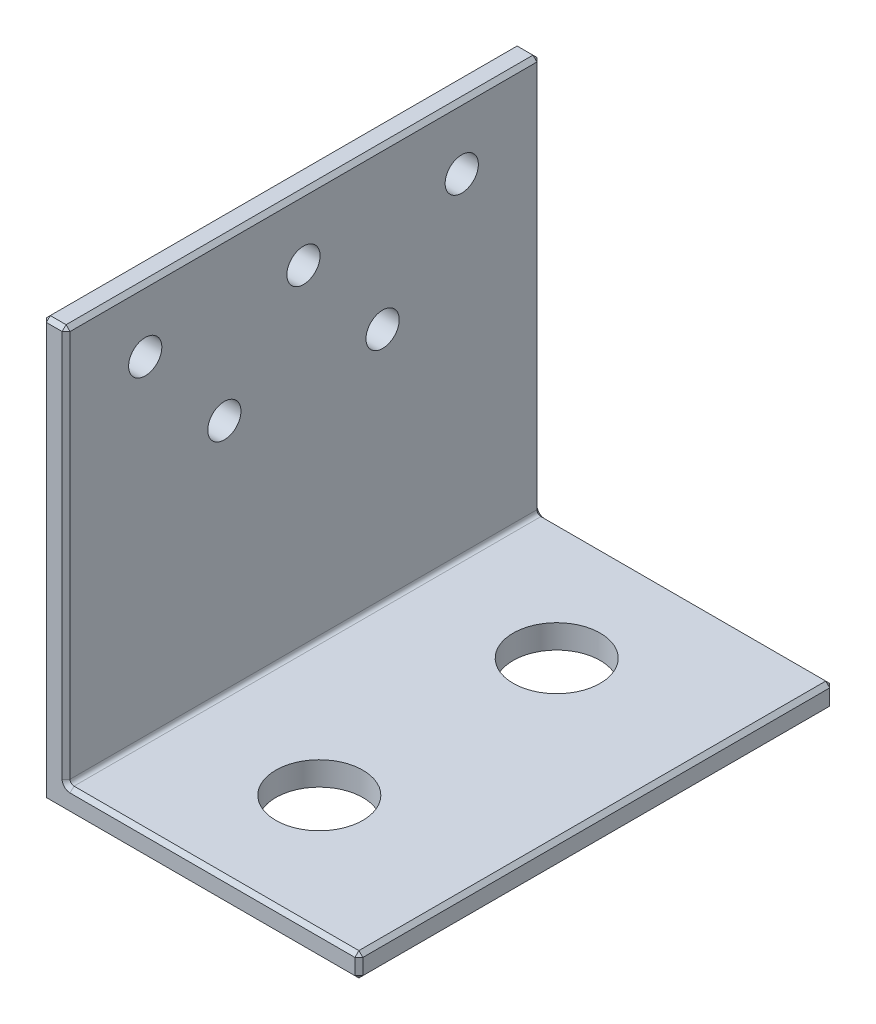
ISO-10303-21;
HEADER;
FILE_DESCRIPTION(('STEP AP214'),'2;1');
FILE_NAME('part.step','',(''),(''),'','','');
FILE_SCHEMA(('AUTOMOTIVE_DESIGN { 1 0 10303 214 1 1 1 1 }'));
ENDSEC;
DATA;
#1=APPLICATION_CONTEXT('core data for automotive mechanical design processes');
#2=APPLICATION_PROTOCOL_DEFINITION('international standard','automotive_design',2000,#1);
#3=PRODUCT_CONTEXT('',#1,'mechanical');
#4=PRODUCT('Part','Part','',(#3));
#5=PRODUCT_RELATED_PRODUCT_CATEGORY('part','',(#4));
#6=PRODUCT_DEFINITION_FORMATION('','',#4);
#7=PRODUCT_DEFINITION_CONTEXT('part definition',#1,'design');
#8=PRODUCT_DEFINITION('design','',#6,#7);
#9=PRODUCT_DEFINITION_SHAPE('','',#8);
#10=(LENGTH_UNIT() NAMED_UNIT(*) SI_UNIT(.MILLI.,.METRE.));
#11=(NAMED_UNIT(*) PLANE_ANGLE_UNIT() SI_UNIT($,.RADIAN.));
#12=(NAMED_UNIT(*) SI_UNIT($,.STERADIAN.) SOLID_ANGLE_UNIT());
#13=UNCERTAINTY_MEASURE_WITH_UNIT(LENGTH_MEASURE(1.E-05),#10,'distance_accuracy_value','');
#14=(GEOMETRIC_REPRESENTATION_CONTEXT(3) GLOBAL_UNCERTAINTY_ASSIGNED_CONTEXT((#13)) GLOBAL_UNIT_ASSIGNED_CONTEXT((#10,
#11,#12)) REPRESENTATION_CONTEXT('',''));
#15=CARTESIAN_POINT('',(0.,0.,0.));
#16=DIRECTION('',(0.,0.,1.));
#17=DIRECTION('',(1.,0.,0.));
#18=AXIS2_PLACEMENT_3D('',#15,#16,#17);
#19=CARTESIAN_POINT('',(0.,0.,60.));
#20=DIRECTION('',(0.,1.,0.));
#21=DIRECTION('',(0.,0.,1.));
#22=AXIS2_PLACEMENT_3D('',#19,#20,#21);
#23=PLANE('',#22);
#24=DIRECTION('',(-1.,0.,0.));
#25=VECTOR('',#24,1.);
#26=CARTESIAN_POINT('',(0.,0.,59.5));
#27=LINE('',#26,#25);
#28=CARTESIAN_POINT('',(39.5,0.,59.5));
#29=VERTEX_POINT('',#28);
#30=CARTESIAN_POINT('',(0.5,0.,59.5));
#31=VERTEX_POINT('',#30);
#32=EDGE_CURVE('E340',#29,#31,#27,.T.);
#33=ORIENTED_EDGE('',*,*,#32,.T.);
#34=DIRECTION('',(0.,0.,-1.));
#35=VECTOR('',#34,1.);
#36=CARTESIAN_POINT('',(0.5,0.,60.));
#37=LINE('',#36,#35);
#38=CARTESIAN_POINT('',(0.5,0.,0.5));
#39=VERTEX_POINT('',#38);
#40=EDGE_CURVE('E346',#31,#39,#37,.T.);
#41=ORIENTED_EDGE('',*,*,#40,.T.);
#42=DIRECTION('',(1.,0.,0.));
#43=VECTOR('',#42,1.);
#44=CARTESIAN_POINT('',(40.,0.,0.5));
#45=LINE('',#44,#43);
#46=CARTESIAN_POINT('',(39.5,0.,0.5));
#47=VERTEX_POINT('',#46);
#48=EDGE_CURVE('E344',#39,#47,#45,.T.);
#49=ORIENTED_EDGE('',*,*,#48,.T.);
#50=DIRECTION('',(0.,0.,1.));
#51=VECTOR('',#50,1.);
#52=CARTESIAN_POINT('',(39.5,0.,60.));
#53=LINE('',#52,#51);
#54=EDGE_CURVE('E342',#47,#29,#53,.T.);
#55=ORIENTED_EDGE('',*,*,#54,.T.);
#56=EDGE_LOOP('',(#33,#41,#49,#55));
#57=FACE_BOUND('',#56,.T.);
#58=CARTESIAN_POINT('',(20.,0.,45.));
#59=DIRECTION('',(0.,1.,0.));
#60=DIRECTION('',(0.,0.,1.));
#61=AXIS2_PLACEMENT_3D('',#58,#59,#60);
#62=CIRCLE('',#61,5.5);
#63=CARTESIAN_POINT('',(20.,0.,50.5));
#64=VERTEX_POINT('',#63);
#65=EDGE_CURVE('E280',#64,#64,#62,.T.);
#66=ORIENTED_EDGE('',*,*,#65,.T.);
#67=EDGE_LOOP('',(#66));
#68=FACE_BOUND('',#67,.T.);
#69=CARTESIAN_POINT('',(20.,0.,15.));
#70=DIRECTION('',(0.,1.,0.));
#71=DIRECTION('',(0.,0.,1.));
#72=AXIS2_PLACEMENT_3D('',#69,#70,#71);
#73=CIRCLE('',#72,5.5);
#74=CARTESIAN_POINT('',(20.,0.,20.5));
#75=VERTEX_POINT('',#74);
#76=EDGE_CURVE('E286',#75,#75,#73,.T.);
#77=ORIENTED_EDGE('',*,*,#76,.T.);
#78=EDGE_LOOP('',(#77));
#79=FACE_BOUND('',#78,.T.);
#80=ADVANCED_FACE('F38',(#57,#68,#79),#23,.F.);
#81=CARTESIAN_POINT('',(40.,0.,60.));
#82=DIRECTION('',(-1.,0.,0.));
#83=DIRECTION('',(0.,0.,1.));
#84=AXIS2_PLACEMENT_3D('',#81,#82,#83);
#85=PLANE('',#84);
#86=DIRECTION('',(0.,-1.,0.));
#87=VECTOR('',#86,1.);
#88=CARTESIAN_POINT('',(40.,0.,59.5));
#89=LINE('',#88,#87);
#90=CARTESIAN_POINT('',(40.,2.5,59.5));
#91=VERTEX_POINT('',#90);
#92=CARTESIAN_POINT('',(40.,0.5,59.5));
#93=VERTEX_POINT('',#92);
#94=EDGE_CURVE('E202',#91,#93,#89,.T.);
#95=ORIENTED_EDGE('',*,*,#94,.T.);
#96=DIRECTION('',(0.,0.,-1.));
#97=VECTOR('',#96,1.);
#98=CARTESIAN_POINT('',(40.,0.5,60.));
#99=LINE('',#98,#97);
#100=CARTESIAN_POINT('',(40.,0.5,0.5));
#101=VERTEX_POINT('',#100);
#102=EDGE_CURVE('E354',#93,#101,#99,.T.);
#103=ORIENTED_EDGE('',*,*,#102,.T.);
#104=DIRECTION('',(0.,1.,0.));
#105=VECTOR('',#104,1.);
#106=CARTESIAN_POINT('',(40.,3.,0.5));
#107=LINE('',#106,#105);
#108=CARTESIAN_POINT('',(40.,2.5,0.5));
#109=VERTEX_POINT('',#108);
#110=EDGE_CURVE('E351',#101,#109,#107,.T.);
#111=ORIENTED_EDGE('',*,*,#110,.T.);
#112=DIRECTION('',(0.,0.,1.));
#113=VECTOR('',#112,1.);
#114=CARTESIAN_POINT('',(40.,2.5,60.));
#115=LINE('',#114,#113);
#116=EDGE_CURVE('E349',#109,#91,#115,.T.);
#117=ORIENTED_EDGE('',*,*,#116,.T.);
#118=EDGE_LOOP('',(#95,#103,#111,#117));
#119=FACE_BOUND('',#118,.T.);
#120=ADVANCED_FACE('F476',(#119),#85,.F.);
#121=CARTESIAN_POINT('',(3.,3.,60.));
#122=DIRECTION('',(0.,-1.,0.));
#123=DIRECTION('',(1.,0.,0.));
#124=AXIS2_PLACEMENT_3D('',#121,#122,#123);
#125=PLANE('',#124);
#126=CARTESIAN_POINT('',(20.,3.,45.));
#127=DIRECTION('',(0.,1.,0.));
#128=DIRECTION('',(0.,0.,1.));
#129=AXIS2_PLACEMENT_3D('',#126,#127,#128);
#130=CIRCLE('',#129,5.5);
#131=CARTESIAN_POINT('',(20.,3.,50.5));
#132=VERTEX_POINT('',#131);
#133=EDGE_CURVE('E277',#132,#132,#130,.T.);
#134=ORIENTED_EDGE('',*,*,#133,.F.);
#135=EDGE_LOOP('',(#134));
#136=FACE_BOUND('',#135,.T.);
#137=CARTESIAN_POINT('',(20.,3.,15.));
#138=DIRECTION('',(0.,1.,0.));
#139=DIRECTION('',(0.,0.,1.));
#140=AXIS2_PLACEMENT_3D('',#137,#138,#139);
#141=CIRCLE('',#140,5.5);
#142=CARTESIAN_POINT('',(20.,3.,20.5));
#143=VERTEX_POINT('',#142);
#144=EDGE_CURVE('E283',#143,#143,#141,.T.);
#145=ORIENTED_EDGE('',*,*,#144,.F.);
#146=EDGE_LOOP('',(#145));
#147=FACE_BOUND('',#146,.T.);
#148=DIRECTION('',(0.,0.,-1.));
#149=VECTOR('',#148,1.);
#150=CARTESIAN_POINT('',(39.5,3.,60.));
#151=LINE('',#150,#149);
#152=CARTESIAN_POINT('',(39.5,3.,59.5));
#153=VERTEX_POINT('',#152);
#154=CARTESIAN_POINT('',(39.5,3.,0.5));
#155=VERTEX_POINT('',#154);
#156=EDGE_CURVE('E47',#153,#155,#151,.T.);
#157=ORIENTED_EDGE('',*,*,#156,.T.);
#158=DIRECTION('',(-1.,0.,0.));
#159=VECTOR('',#158,1.);
#160=CARTESIAN_POINT('',(3.5,3.,0.5));
#161=LINE('',#160,#159);
#162=CARTESIAN_POINT('',(3.5,3.,0.5));
#163=VERTEX_POINT('',#162);
#164=EDGE_CURVE('E11',#155,#163,#161,.T.);
#165=ORIENTED_EDGE('',*,*,#164,.T.);
#166=DIRECTION('',(0.,0.,-1.));
#167=VECTOR('',#166,1.);
#168=CARTESIAN_POINT('',(3.5,3.,60.));
#169=LINE('',#168,#167);
#170=CARTESIAN_POINT('',(3.5,3.,59.5));
#171=VERTEX_POINT('',#170);
#172=EDGE_CURVE('E191',#163,#171,#169,.F.);
#173=ORIENTED_EDGE('',*,*,#172,.T.);
#174=DIRECTION('',(1.,0.,0.));
#175=VECTOR('',#174,1.);
#176=CARTESIAN_POINT('',(3.,3.,59.5));
#177=LINE('',#176,#175);
#178=EDGE_CURVE('E58',#171,#153,#177,.T.);
#179=ORIENTED_EDGE('',*,*,#178,.T.);
#180=EDGE_LOOP('',(#157,#165,#173,#179));
#181=FACE_BOUND('',#180,.T.);
#182=ADVANCED_FACE('F481',(#136,#147,#181),#125,.F.);
#183=CARTESIAN_POINT('',(3.,53.,60.));
#184=DIRECTION('',(-1.,0.,0.));
#185=DIRECTION('',(0.,-1.,0.));
#186=AXIS2_PLACEMENT_3D('',#183,#184,#185);
#187=PLANE('',#186);
#188=CARTESIAN_POINT('',(3.,45.,50.));
#189=DIRECTION('',(1.,0.,0.));
#190=DIRECTION('',(0.,0.,-1.));
#191=AXIS2_PLACEMENT_3D('',#188,#189,#190);
#192=CIRCLE('',#191,2.1);
#193=CARTESIAN_POINT('',(3.,45.,47.9));
#194=VERTEX_POINT('',#193);
#195=EDGE_CURVE('E240',#194,#194,#192,.T.);
#196=ORIENTED_EDGE('',*,*,#195,.F.);
#197=EDGE_LOOP('',(#196));
#198=FACE_BOUND('',#197,.T.);
#199=CARTESIAN_POINT('',(3.,33.,40.));
#200=DIRECTION('',(1.,0.,0.));
#201=DIRECTION('',(0.,0.,-1.));
#202=AXIS2_PLACEMENT_3D('',#199,#200,#201);
#203=CIRCLE('',#202,2.1);
#204=CARTESIAN_POINT('',(3.,33.,37.9));
#205=VERTEX_POINT('',#204);
#206=EDGE_CURVE('E251',#205,#205,#203,.T.);
#207=ORIENTED_EDGE('',*,*,#206,.F.);
#208=EDGE_LOOP('',(#207));
#209=FACE_BOUND('',#208,.T.);
#210=CARTESIAN_POINT('',(3.,45.,30.));
#211=DIRECTION('',(1.,0.,0.));
#212=DIRECTION('',(0.,0.,-1.));
#213=AXIS2_PLACEMENT_3D('',#210,#211,#212);
#214=CIRCLE('',#213,2.1);
#215=CARTESIAN_POINT('',(3.,45.,27.9));
#216=VERTEX_POINT('',#215);
#217=EDGE_CURVE('E259',#216,#216,#214,.T.);
#218=ORIENTED_EDGE('',*,*,#217,.F.);
#219=EDGE_LOOP('',(#218));
#220=FACE_BOUND('',#219,.T.);
#221=CARTESIAN_POINT('',(3.,33.,20.));
#222=DIRECTION('',(1.,0.,0.));
#223=DIRECTION('',(0.,0.,-1.));
#224=AXIS2_PLACEMENT_3D('',#221,#222,#223);
#225=CIRCLE('',#224,2.1);
#226=CARTESIAN_POINT('',(3.,33.,17.9));
#227=VERTEX_POINT('',#226);
#228=EDGE_CURVE('E265',#227,#227,#225,.T.);
#229=ORIENTED_EDGE('',*,*,#228,.F.);
#230=EDGE_LOOP('',(#229));
#231=FACE_BOUND('',#230,.T.);
#232=CARTESIAN_POINT('',(3.,45.,10.));
#233=DIRECTION('',(1.,0.,0.));
#234=DIRECTION('',(0.,0.,-1.));
#235=AXIS2_PLACEMENT_3D('',#232,#233,#234);
#236=CIRCLE('',#235,2.1);
#237=CARTESIAN_POINT('',(3.,45.,7.9));
#238=VERTEX_POINT('',#237);
#239=EDGE_CURVE('E271',#238,#238,#236,.T.);
#240=ORIENTED_EDGE('',*,*,#239,.F.);
#241=EDGE_LOOP('',(#240));
#242=FACE_BOUND('',#241,.T.);
#243=DIRECTION('',(0.,0.,-1.));
#244=VECTOR('',#243,1.);
#245=CARTESIAN_POINT('',(3.,3.5,0.));
#246=LINE('',#245,#244);
#247=CARTESIAN_POINT('',(3.,3.5,59.5));
#248=VERTEX_POINT('',#247);
#249=CARTESIAN_POINT('',(3.,3.5,0.5));
#250=VERTEX_POINT('',#249);
#251=EDGE_CURVE('E288',#248,#250,#246,.T.);
#252=ORIENTED_EDGE('',*,*,#251,.T.);
#253=DIRECTION('',(0.,1.,0.));
#254=VECTOR('',#253,1.);
#255=CARTESIAN_POINT('',(3.,53.,0.5));
#256=LINE('',#255,#254);
#257=CARTESIAN_POINT('',(3.,52.5,0.5));
#258=VERTEX_POINT('',#257);
#259=EDGE_CURVE('E323',#250,#258,#256,.T.);
#260=ORIENTED_EDGE('',*,*,#259,.T.);
#261=DIRECTION('',(0.,0.,1.));
#262=VECTOR('',#261,1.);
#263=CARTESIAN_POINT('',(3.,52.5,60.));
#264=LINE('',#263,#262);
#265=CARTESIAN_POINT('',(3.,52.5,59.5));
#266=VERTEX_POINT('',#265);
#267=EDGE_CURVE('E320',#258,#266,#264,.T.);
#268=ORIENTED_EDGE('',*,*,#267,.T.);
#269=DIRECTION('',(0.,-1.,0.));
#270=VECTOR('',#269,1.);
#271=CARTESIAN_POINT('',(3.,53.,59.5));
#272=LINE('',#271,#270);
#273=EDGE_CURVE('E318',#266,#248,#272,.T.);
#274=ORIENTED_EDGE('',*,*,#273,.T.);
#275=EDGE_LOOP('',(#252,#260,#268,#274));
#276=FACE_BOUND('',#275,.T.);
#277=ADVANCED_FACE('F526',(#198,#209,#220,#231,#242,#276),#187,.F.);
#278=CARTESIAN_POINT('',(0.,53.,60.));
#279=DIRECTION('',(0.,-1.,0.));
#280=DIRECTION('',(0.,0.,-1.));
#281=AXIS2_PLACEMENT_3D('',#278,#279,#280);
#282=PLANE('',#281);
#283=DIRECTION('',(1.,0.,0.));
#284=VECTOR('',#283,1.);
#285=CARTESIAN_POINT('',(0.,53.,59.5));
#286=LINE('',#285,#284);
#287=CARTESIAN_POINT('',(0.5,53.,59.5));
#288=VERTEX_POINT('',#287);
#289=CARTESIAN_POINT('',(2.5,53.,59.5));
#290=VERTEX_POINT('',#289);
#291=EDGE_CURVE('E313',#288,#290,#286,.T.);
#292=ORIENTED_EDGE('',*,*,#291,.T.);
#293=DIRECTION('',(0.,0.,-1.));
#294=VECTOR('',#293,1.);
#295=CARTESIAN_POINT('',(2.5,53.,60.));
#296=LINE('',#295,#294);
#297=CARTESIAN_POINT('',(2.5,53.,0.5));
#298=VERTEX_POINT('',#297);
#299=EDGE_CURVE('E315',#290,#298,#296,.T.);
#300=ORIENTED_EDGE('',*,*,#299,.T.);
#301=DIRECTION('',(-1.,0.,0.));
#302=VECTOR('',#301,1.);
#303=CARTESIAN_POINT('',(0.,53.,0.5));
#304=LINE('',#303,#302);
#305=CARTESIAN_POINT('',(0.5,53.,0.5));
#306=VERTEX_POINT('',#305);
#307=EDGE_CURVE('E309',#298,#306,#304,.T.);
#308=ORIENTED_EDGE('',*,*,#307,.T.);
#309=DIRECTION('',(0.,0.,1.));
#310=VECTOR('',#309,1.);
#311=CARTESIAN_POINT('',(0.5,53.,60.));
#312=LINE('',#311,#310);
#313=EDGE_CURVE('E311',#306,#288,#312,.T.);
#314=ORIENTED_EDGE('',*,*,#313,.T.);
#315=EDGE_LOOP('',(#292,#300,#308,#314));
#316=FACE_BOUND('',#315,.T.);
#317=ADVANCED_FACE('F538',(#316),#282,.F.);
#318=CARTESIAN_POINT('',(0.,3.,60.));
#319=DIRECTION('',(1.,0.,0.));
#320=DIRECTION('',(0.,0.,-1.));
#321=AXIS2_PLACEMENT_3D('',#318,#319,#320);
#322=PLANE('',#321);
#323=DIRECTION('',(0.,0.,1.));
#324=VECTOR('',#323,1.);
#325=CARTESIAN_POINT('',(0.,0.5,60.));
#326=LINE('',#325,#324);
#327=CARTESIAN_POINT('',(0.,0.5,0.5));
#328=VERTEX_POINT('',#327);
#329=CARTESIAN_POINT('',(0.,0.5,59.5));
#330=VERTEX_POINT('',#329);
#331=EDGE_CURVE('E302',#328,#330,#326,.T.);
#332=ORIENTED_EDGE('',*,*,#331,.T.);
#333=DIRECTION('',(0.,1.,0.));
#334=VECTOR('',#333,1.);
#335=CARTESIAN_POINT('',(0.,3.,59.5));
#336=LINE('',#335,#334);
#337=CARTESIAN_POINT('',(0.,52.5,59.5));
#338=VERTEX_POINT('',#337);
#339=EDGE_CURVE('E306',#330,#338,#336,.T.);
#340=ORIENTED_EDGE('',*,*,#339,.T.);
#341=DIRECTION('',(0.,0.,-1.));
#342=VECTOR('',#341,1.);
#343=CARTESIAN_POINT('',(0.,52.5,60.));
#344=LINE('',#343,#342);
#345=CARTESIAN_POINT('',(0.,52.5,0.5));
#346=VERTEX_POINT('',#345);
#347=EDGE_CURVE('E304',#338,#346,#344,.T.);
#348=ORIENTED_EDGE('',*,*,#347,.T.);
#349=DIRECTION('',(0.,-1.,0.));
#350=VECTOR('',#349,1.);
#351=CARTESIAN_POINT('',(0.,0.,0.5));
#352=LINE('',#351,#350);
#353=EDGE_CURVE('E300',#346,#328,#352,.T.);
#354=ORIENTED_EDGE('',*,*,#353,.T.);
#355=EDGE_LOOP('',(#332,#340,#348,#354));
#356=FACE_BOUND('',#355,.T.);
#357=CARTESIAN_POINT('',(0.,45.,50.));
#358=DIRECTION('',(1.,0.,0.));
#359=DIRECTION('',(0.,0.,-1.));
#360=AXIS2_PLACEMENT_3D('',#357,#358,#359);
#361=CIRCLE('',#360,2.1);
#362=CARTESIAN_POINT('',(0.,45.,47.9));
#363=VERTEX_POINT('',#362);
#364=EDGE_CURVE('E246',#363,#363,#361,.T.);
#365=ORIENTED_EDGE('',*,*,#364,.T.);
#366=EDGE_LOOP('',(#365));
#367=FACE_BOUND('',#366,.T.);
#368=CARTESIAN_POINT('',(0.,33.,40.));
#369=DIRECTION('',(1.,0.,0.));
#370=DIRECTION('',(0.,0.,-1.));
#371=AXIS2_PLACEMENT_3D('',#368,#369,#370);
#372=CIRCLE('',#371,2.1);
#373=CARTESIAN_POINT('',(0.,33.,37.9));
#374=VERTEX_POINT('',#373);
#375=EDGE_CURVE('E256',#374,#374,#372,.T.);
#376=ORIENTED_EDGE('',*,*,#375,.T.);
#377=EDGE_LOOP('',(#376));
#378=FACE_BOUND('',#377,.T.);
#379=CARTESIAN_POINT('',(0.,45.,30.));
#380=DIRECTION('',(1.,0.,0.));
#381=DIRECTION('',(0.,0.,-1.));
#382=AXIS2_PLACEMENT_3D('',#379,#380,#381);
#383=CIRCLE('',#382,2.1);
#384=CARTESIAN_POINT('',(0.,45.,27.9));
#385=VERTEX_POINT('',#384);
#386=EDGE_CURVE('E262',#385,#385,#383,.T.);
#387=ORIENTED_EDGE('',*,*,#386,.T.);
#388=EDGE_LOOP('',(#387));
#389=FACE_BOUND('',#388,.T.);
#390=CARTESIAN_POINT('',(0.,33.,20.));
#391=DIRECTION('',(1.,0.,0.));
#392=DIRECTION('',(0.,0.,-1.));
#393=AXIS2_PLACEMENT_3D('',#390,#391,#392);
#394=CIRCLE('',#393,2.1);
#395=CARTESIAN_POINT('',(0.,33.,17.9));
#396=VERTEX_POINT('',#395);
#397=EDGE_CURVE('E268',#396,#396,#394,.T.);
#398=ORIENTED_EDGE('',*,*,#397,.T.);
#399=EDGE_LOOP('',(#398));
#400=FACE_BOUND('',#399,.T.);
#401=CARTESIAN_POINT('',(0.,45.,10.));
#402=DIRECTION('',(1.,0.,0.));
#403=DIRECTION('',(0.,0.,-1.));
#404=AXIS2_PLACEMENT_3D('',#401,#402,#403);
#405=CIRCLE('',#404,2.1);
#406=CARTESIAN_POINT('',(0.,45.,7.9));
#407=VERTEX_POINT('',#406);
#408=EDGE_CURVE('E274',#407,#407,#405,.T.);
#409=ORIENTED_EDGE('',*,*,#408,.T.);
#410=EDGE_LOOP('',(#409));
#411=FACE_BOUND('',#410,.T.);
#412=ADVANCED_FACE('F450',(#356,#367,#378,#389,#400,#411),#322,.F.);
#413=CARTESIAN_POINT('',(0.,0.,60.));
#414=DIRECTION('',(0.,0.,-1.));
#415=DIRECTION('',(-1.,0.,0.));
#416=AXIS2_PLACEMENT_3D('',#413,#414,#415);
#417=PLANE('',#416);
#418=DIRECTION('',(-1.,0.,0.));
#419=VECTOR('',#418,1.);
#420=CARTESIAN_POINT('',(0.,52.5,60.));
#421=LINE('',#420,#419);
#422=CARTESIAN_POINT('',(2.5,52.5,60.));
#423=VERTEX_POINT('',#422);
#424=CARTESIAN_POINT('',(0.5,52.5,60.));
#425=VERTEX_POINT('',#424);
#426=EDGE_CURVE('E296',#423,#425,#421,.T.);
#427=ORIENTED_EDGE('',*,*,#426,.T.);
#428=DIRECTION('',(0.,-1.,0.));
#429=VECTOR('',#428,1.);
#430=CARTESIAN_POINT('',(0.5,0.,60.));
#431=LINE('',#430,#429);
#432=CARTESIAN_POINT('',(0.5,0.5,60.));
#433=VERTEX_POINT('',#432);
#434=EDGE_CURVE('E298',#425,#433,#431,.T.);
#435=ORIENTED_EDGE('',*,*,#434,.T.);
#436=DIRECTION('',(1.,0.,0.));
#437=VECTOR('',#436,1.);
#438=CARTESIAN_POINT('',(0.,0.5,60.));
#439=LINE('',#438,#437);
#440=CARTESIAN_POINT('',(39.5,0.5,60.));
#441=VERTEX_POINT('',#440);
#442=EDGE_CURVE('E174',#433,#441,#439,.T.);
#443=ORIENTED_EDGE('',*,*,#442,.T.);
#444=DIRECTION('',(0.,1.,0.));
#445=VECTOR('',#444,1.);
#446=CARTESIAN_POINT('',(39.5,0.,60.));
#447=LINE('',#446,#445);
#448=CARTESIAN_POINT('',(39.5,2.5,60.));
#449=VERTEX_POINT('',#448);
#450=EDGE_CURVE('E167',#441,#449,#447,.T.);
#451=ORIENTED_EDGE('',*,*,#450,.T.);
#452=DIRECTION('',(-1.,0.,0.));
#453=VECTOR('',#452,1.);
#454=CARTESIAN_POINT('',(0.,2.5,60.));
#455=LINE('',#454,#453);
#456=CARTESIAN_POINT('',(3.5,2.5,60.));
#457=VERTEX_POINT('',#456);
#458=EDGE_CURVE('E170',#449,#457,#455,.T.);
#459=ORIENTED_EDGE('',*,*,#458,.T.);
#460=CARTESIAN_POINT('',(3.5,3.5,60.));
#461=DIRECTION('',(0.,0.,-1.));
#462=DIRECTION('',(-1.,0.,0.));
#463=AXIS2_PLACEMENT_3D('',#460,#461,#462);
#464=CIRCLE('',#463,1.);
#465=CARTESIAN_POINT('',(2.5,3.5,60.));
#466=VERTEX_POINT('',#465);
#467=EDGE_CURVE('E190',#457,#466,#464,.T.);
#468=ORIENTED_EDGE('',*,*,#467,.T.);
#469=DIRECTION('',(0.,1.,0.));
#470=VECTOR('',#469,1.);
#471=CARTESIAN_POINT('',(2.5,0.,60.));
#472=LINE('',#471,#470);
#473=EDGE_CURVE('E179',#466,#423,#472,.T.);
#474=ORIENTED_EDGE('',*,*,#473,.T.);
#475=EDGE_LOOP('',(#427,#435,#443,#451,#459,#468,#474));
#476=FACE_BOUND('',#475,.T.);
#477=ADVANCED_FACE('F169',(#476),#417,.F.);
#478=CARTESIAN_POINT('',(0.,0.,0.));
#479=DIRECTION('',(0.,0.,-1.));
#480=DIRECTION('',(-1.,0.,0.));
#481=AXIS2_PLACEMENT_3D('',#478,#479,#480);
#482=PLANE('',#481);
#483=DIRECTION('',(0.,1.,0.));
#484=VECTOR('',#483,1.);
#485=CARTESIAN_POINT('',(0.5,53.,0.));
#486=LINE('',#485,#484);
#487=CARTESIAN_POINT('',(0.5,0.5,0.));
#488=VERTEX_POINT('',#487);
#489=CARTESIAN_POINT('',(0.5,52.5,0.));
#490=VERTEX_POINT('',#489);
#491=EDGE_CURVE('E335',#488,#490,#486,.T.);
#492=ORIENTED_EDGE('',*,*,#491,.T.);
#493=DIRECTION('',(1.,0.,0.));
#494=VECTOR('',#493,1.);
#495=CARTESIAN_POINT('',(3.,52.5,0.));
#496=LINE('',#495,#494);
#497=CARTESIAN_POINT('',(2.5,52.5,0.));
#498=VERTEX_POINT('',#497);
#499=EDGE_CURVE('E337',#490,#498,#496,.T.);
#500=ORIENTED_EDGE('',*,*,#499,.T.);
#501=DIRECTION('',(0.,-1.,0.));
#502=VECTOR('',#501,1.);
#503=CARTESIAN_POINT('',(2.5,3.5,0.));
#504=LINE('',#503,#502);
#505=CARTESIAN_POINT('',(2.5,3.5,0.));
#506=VERTEX_POINT('',#505);
#507=EDGE_CURVE('E329',#498,#506,#504,.T.);
#508=ORIENTED_EDGE('',*,*,#507,.T.);
#509=CARTESIAN_POINT('',(3.5,3.5,0.));
#510=DIRECTION('',(0.,0.,-1.));
#511=DIRECTION('',(-1.,0.,0.));
#512=AXIS2_PLACEMENT_3D('',#509,#510,#511);
#513=CIRCLE('',#512,1.);
#514=CARTESIAN_POINT('',(3.5,2.5,0.));
#515=VERTEX_POINT('',#514);
#516=EDGE_CURVE('E327',#506,#515,#513,.F.);
#517=ORIENTED_EDGE('',*,*,#516,.T.);
#518=DIRECTION('',(1.,0.,0.));
#519=VECTOR('',#518,1.);
#520=CARTESIAN_POINT('',(40.,2.5,0.));
#521=LINE('',#520,#519);
#522=CARTESIAN_POINT('',(39.5,2.5,0.));
#523=VERTEX_POINT('',#522);
#524=EDGE_CURVE('E325',#515,#523,#521,.T.);
#525=ORIENTED_EDGE('',*,*,#524,.T.);
#526=DIRECTION('',(0.,-1.,0.));
#527=VECTOR('',#526,1.);
#528=CARTESIAN_POINT('',(39.5,0.,0.));
#529=LINE('',#528,#527);
#530=CARTESIAN_POINT('',(39.5,0.5,0.));
#531=VERTEX_POINT('',#530);
#532=EDGE_CURVE('E331',#523,#531,#529,.T.);
#533=ORIENTED_EDGE('',*,*,#532,.T.);
#534=DIRECTION('',(-1.,0.,0.));
#535=VECTOR('',#534,1.);
#536=CARTESIAN_POINT('',(0.,0.5,0.));
#537=LINE('',#536,#535);
#538=EDGE_CURVE('E333',#531,#488,#537,.T.);
#539=ORIENTED_EDGE('',*,*,#538,.T.);
#540=EDGE_LOOP('',(#492,#500,#508,#517,#525,#533,#539));
#541=FACE_BOUND('',#540,.T.);
#542=ADVANCED_FACE('F548',(#541),#482,.T.);
#543=CARTESIAN_POINT('',(20.,3.,15.));
#544=DIRECTION('',(0.,1.,0.));
#545=DIRECTION('',(0.,0.,1.));
#546=AXIS2_PLACEMENT_3D('',#543,#544,#545);
#547=CYLINDRICAL_SURFACE('',#546,5.5);
#548=ORIENTED_EDGE('',*,*,#144,.T.);
#549=EDGE_LOOP('',(#548));
#550=FACE_BOUND('',#549,.T.);
#551=ORIENTED_EDGE('',*,*,#76,.F.);
#552=EDGE_LOOP('',(#551));
#553=FACE_BOUND('',#552,.T.);
#554=ADVANCED_FACE('F813',(#550,#553),#547,.F.);
#555=CARTESIAN_POINT('',(20.,3.,45.));
#556=DIRECTION('',(0.,1.,0.));
#557=DIRECTION('',(0.,0.,1.));
#558=AXIS2_PLACEMENT_3D('',#555,#556,#557);
#559=CYLINDRICAL_SURFACE('',#558,5.5);
#560=ORIENTED_EDGE('',*,*,#133,.T.);
#561=EDGE_LOOP('',(#560));
#562=FACE_BOUND('',#561,.T.);
#563=ORIENTED_EDGE('',*,*,#65,.F.);
#564=EDGE_LOOP('',(#563));
#565=FACE_BOUND('',#564,.T.);
#566=ADVANCED_FACE('F803',(#562,#565),#559,.F.);
#567=CARTESIAN_POINT('',(3.,45.,10.));
#568=DIRECTION('',(1.,0.,0.));
#569=DIRECTION('',(0.,0.,-1.));
#570=AXIS2_PLACEMENT_3D('',#567,#568,#569);
#571=CYLINDRICAL_SURFACE('',#570,2.1);
#572=ORIENTED_EDGE('',*,*,#239,.T.);
#573=EDGE_LOOP('',(#572));
#574=FACE_BOUND('',#573,.T.);
#575=ORIENTED_EDGE('',*,*,#408,.F.);
#576=EDGE_LOOP('',(#575));
#577=FACE_BOUND('',#576,.T.);
#578=ADVANCED_FACE('F793',(#574,#577),#571,.F.);
#579=CARTESIAN_POINT('',(3.,33.,20.));
#580=DIRECTION('',(1.,0.,0.));
#581=DIRECTION('',(0.,0.,-1.));
#582=AXIS2_PLACEMENT_3D('',#579,#580,#581);
#583=CYLINDRICAL_SURFACE('',#582,2.1);
#584=ORIENTED_EDGE('',*,*,#228,.T.);
#585=EDGE_LOOP('',(#584));
#586=FACE_BOUND('',#585,.T.);
#587=ORIENTED_EDGE('',*,*,#397,.F.);
#588=EDGE_LOOP('',(#587));
#589=FACE_BOUND('',#588,.T.);
#590=ADVANCED_FACE('F783',(#586,#589),#583,.F.);
#591=CARTESIAN_POINT('',(3.,45.,30.));
#592=DIRECTION('',(1.,0.,0.));
#593=DIRECTION('',(0.,0.,-1.));
#594=AXIS2_PLACEMENT_3D('',#591,#592,#593);
#595=CYLINDRICAL_SURFACE('',#594,2.1);
#596=ORIENTED_EDGE('',*,*,#217,.T.);
#597=EDGE_LOOP('',(#596));
#598=FACE_BOUND('',#597,.T.);
#599=ORIENTED_EDGE('',*,*,#386,.F.);
#600=EDGE_LOOP('',(#599));
#601=FACE_BOUND('',#600,.T.);
#602=ADVANCED_FACE('F773',(#598,#601),#595,.F.);
#603=CARTESIAN_POINT('',(3.,33.,40.));
#604=DIRECTION('',(1.,0.,0.));
#605=DIRECTION('',(0.,0.,-1.));
#606=AXIS2_PLACEMENT_3D('',#603,#604,#605);
#607=CYLINDRICAL_SURFACE('',#606,2.1);
#608=ORIENTED_EDGE('',*,*,#206,.T.);
#609=EDGE_LOOP('',(#608));
#610=FACE_BOUND('',#609,.T.);
#611=ORIENTED_EDGE('',*,*,#375,.F.);
#612=EDGE_LOOP('',(#611));
#613=FACE_BOUND('',#612,.T.);
#614=ADVANCED_FACE('F764',(#610,#613),#607,.F.);
#615=CARTESIAN_POINT('',(3.,45.,50.));
#616=DIRECTION('',(1.,0.,0.));
#617=DIRECTION('',(0.,0.,-1.));
#618=AXIS2_PLACEMENT_3D('',#615,#616,#617);
#619=CYLINDRICAL_SURFACE('',#618,2.1);
#620=ORIENTED_EDGE('',*,*,#195,.T.);
#621=EDGE_LOOP('',(#620));
#622=FACE_BOUND('',#621,.T.);
#623=ORIENTED_EDGE('',*,*,#364,.F.);
#624=EDGE_LOOP('',(#623));
#625=FACE_BOUND('',#624,.T.);
#626=ADVANCED_FACE('F489',(#622,#625),#619,.F.);
#627=CARTESIAN_POINT('',(3.5,3.5,60.));
#628=DIRECTION('',(0.,0.,1.));
#629=DIRECTION('',(1.,0.,0.));
#630=AXIS2_PLACEMENT_3D('',#627,#628,#629);
#631=CYLINDRICAL_SURFACE('',#630,0.5);
#632=ORIENTED_EDGE('',*,*,#172,.F.);
#633=CARTESIAN_POINT('',(3.5,3.5,0.5));
#634=DIRECTION('',(0.,0.,-1.));
#635=DIRECTION('',(-1.,0.,0.));
#636=AXIS2_PLACEMENT_3D('',#633,#634,#635);
#637=CIRCLE('',#636,0.5);
#638=EDGE_CURVE('E359',#163,#250,#637,.T.);
#639=ORIENTED_EDGE('',*,*,#638,.T.);
#640=ORIENTED_EDGE('',*,*,#251,.F.);
#641=CARTESIAN_POINT('',(3.5,3.5,59.5));
#642=DIRECTION('',(0.,0.,-1.));
#643=DIRECTION('',(-1.,0.,0.));
#644=AXIS2_PLACEMENT_3D('',#641,#642,#643);
#645=CIRCLE('',#644,0.5);
#646=EDGE_CURVE('E357',#248,#171,#645,.F.);
#647=ORIENTED_EDGE('',*,*,#646,.T.);
#648=EDGE_LOOP('',(#632,#639,#640,#647));
#649=FACE_BOUND('',#648,.T.);
#650=ADVANCED_FACE('F486',(#649),#631,.F.);
#651=CARTESIAN_POINT('',(3.,3.,0.5));
#652=DIRECTION('',(0.,0.707106781186548,-0.707106781186547));
#653=DIRECTION('',(1.,0.,0.));
#654=AXIS2_PLACEMENT_3D('',#651,#652,#653);
#655=PLANE('',#654);
#656=DIRECTION('',(0.,0.707106781186547,0.707106781186548));
#657=VECTOR('',#656,1.);
#658=CARTESIAN_POINT('',(39.5,2.75,0.25));
#659=LINE('',#658,#657);
#660=EDGE_CURVE('E233',#523,#155,#659,.T.);
#661=ORIENTED_EDGE('',*,*,#660,.F.);
#662=ORIENTED_EDGE('',*,*,#524,.F.);
#663=DIRECTION('',(0.,-0.707106781186547,-0.707106781186547));
#664=VECTOR('',#663,1.);
#665=CARTESIAN_POINT('',(3.5,3.,0.5));
#666=LINE('',#665,#664);
#667=EDGE_CURVE('E42',#163,#515,#666,.T.);
#668=ORIENTED_EDGE('',*,*,#667,.F.);
#669=ORIENTED_EDGE('',*,*,#164,.F.);
#670=EDGE_LOOP('',(#661,#662,#668,#669));
#671=FACE_BOUND('',#670,.T.);
#672=ADVANCED_FACE('F40',(#671),#655,.T.);
#673=CARTESIAN_POINT('',(3.5,3.5,0.));
#674=DIRECTION('',(0.,0.,-1.));
#675=DIRECTION('',(-1.,0.,0.));
#676=AXIS2_PLACEMENT_3D('',#673,#674,#675);
#677=CONICAL_SURFACE('',#676,1.,0.785398163397448);
#678=ORIENTED_EDGE('',*,*,#667,.T.);
#679=ORIENTED_EDGE('',*,*,#516,.F.);
#680=DIRECTION('',(-0.707106781186547,0.,-0.707106781186547));
#681=VECTOR('',#680,1.);
#682=CARTESIAN_POINT('',(3.,3.5,0.5));
#683=LINE('',#682,#681);
#684=EDGE_CURVE('E231',#250,#506,#683,.T.);
#685=ORIENTED_EDGE('',*,*,#684,.F.);
#686=ORIENTED_EDGE('',*,*,#638,.F.);
#687=EDGE_LOOP('',(#678,#679,#685,#686));
#688=FACE_BOUND('',#687,.T.);
#689=ADVANCED_FACE('F558',(#688),#677,.F.);
#690=CARTESIAN_POINT('',(40.,2.5,0.5));
#691=DIRECTION('',(0.577350269189626,0.577350269189626,-0.577350269189626));
#692=DIRECTION('',(-0.707106781186547,0.,-0.707106781186547));
#693=AXIS2_PLACEMENT_3D('',#690,#691,#692);
#694=PLANE('',#693);
#695=DIRECTION('',(-0.707106781186547,0.,-0.707106781186547));
#696=VECTOR('',#695,1.);
#697=CARTESIAN_POINT('',(40.,2.5,0.5));
#698=LINE('',#697,#696);
#699=EDGE_CURVE('E225',#523,#109,#698,.F.);
#700=ORIENTED_EDGE('',*,*,#699,.F.);
#701=ORIENTED_EDGE('',*,*,#660,.T.);
#702=DIRECTION('',(-0.707106781186547,0.707106781186547,0.));
#703=VECTOR('',#702,1.);
#704=CARTESIAN_POINT('',(40.,2.5,0.5));
#705=LINE('',#704,#703);
#706=EDGE_CURVE('E228',#109,#155,#705,.T.);
#707=ORIENTED_EDGE('',*,*,#706,.F.);
#708=EDGE_LOOP('',(#700,#701,#707));
#709=FACE_BOUND('',#708,.T.);
#710=ADVANCED_FACE('F556',(#709),#694,.T.);
#711=CARTESIAN_POINT('',(3.,53.,0.5));
#712=DIRECTION('',(0.707106781186547,0.,-0.707106781186548));
#713=DIRECTION('',(0.,-1.,0.));
#714=AXIS2_PLACEMENT_3D('',#711,#712,#713);
#715=PLANE('',#714);
#716=ORIENTED_EDGE('',*,*,#684,.T.);
#717=ORIENTED_EDGE('',*,*,#507,.F.);
#718=DIRECTION('',(-0.707106781186548,0.,-0.707106781186547));
#719=VECTOR('',#718,1.);
#720=CARTESIAN_POINT('',(2.75,52.5,0.25));
#721=LINE('',#720,#719);
#722=EDGE_CURVE('E222',#258,#498,#721,.T.);
#723=ORIENTED_EDGE('',*,*,#722,.F.);
#724=ORIENTED_EDGE('',*,*,#259,.F.);
#725=EDGE_LOOP('',(#716,#717,#723,#724));
#726=FACE_BOUND('',#725,.T.);
#727=ADVANCED_FACE('F533',(#726),#715,.T.);
#728=CARTESIAN_POINT('',(0.,2.5,60.));
#729=DIRECTION('',(0.,-0.707106781186548,-0.707106781186547));
#730=DIRECTION('',(-1.,0.,0.));
#731=AXIS2_PLACEMENT_3D('',#728,#729,#730);
#732=PLANE('',#731);
#733=DIRECTION('',(0.,0.707106781186547,-0.707106781186548));
#734=VECTOR('',#733,1.);
#735=CARTESIAN_POINT('',(39.5,2.5,60.));
#736=LINE('',#735,#734);
#737=EDGE_CURVE('E185',#153,#449,#736,.F.);
#738=ORIENTED_EDGE('',*,*,#737,.F.);
#739=ORIENTED_EDGE('',*,*,#178,.F.);
#740=DIRECTION('',(0.,0.707106781186547,-0.707106781186547));
#741=VECTOR('',#740,1.);
#742=CARTESIAN_POINT('',(3.5,2.5,60.));
#743=LINE('',#742,#741);
#744=EDGE_CURVE('E188',#457,#171,#743,.T.);
#745=ORIENTED_EDGE('',*,*,#744,.F.);
#746=ORIENTED_EDGE('',*,*,#458,.F.);
#747=EDGE_LOOP('',(#738,#739,#745,#746));
#748=FACE_BOUND('',#747,.T.);
#749=ADVANCED_FACE('F184',(#748),#732,.F.);
#750=CARTESIAN_POINT('',(39.5,3.,60.));
#751=DIRECTION('',(-0.707106781186547,-0.707106781186547,0.));
#752=DIRECTION('',(0.,0.,-1.));
#753=AXIS2_PLACEMENT_3D('',#750,#751,#752);
#754=PLANE('',#753);
#755=ORIENTED_EDGE('',*,*,#706,.T.);
#756=ORIENTED_EDGE('',*,*,#156,.F.);
#757=DIRECTION('',(0.707106781186547,-0.707106781186547,0.));
#758=VECTOR('',#757,1.);
#759=CARTESIAN_POINT('',(39.75,2.75,59.5));
#760=LINE('',#759,#758);
#761=EDGE_CURVE('E199',#91,#153,#760,.F.);
#762=ORIENTED_EDGE('',*,*,#761,.F.);
#763=ORIENTED_EDGE('',*,*,#116,.F.);
#764=EDGE_LOOP('',(#755,#756,#762,#763));
#765=FACE_BOUND('',#764,.T.);
#766=ADVANCED_FACE('F555',(#765),#754,.F.);
#767=CARTESIAN_POINT('',(40.,0.,0.5));
#768=DIRECTION('',(0.707106781186547,0.,-0.707106781186547));
#769=DIRECTION('',(0.,-1.,0.));
#770=AXIS2_PLACEMENT_3D('',#767,#768,#769);
#771=PLANE('',#770);
#772=ORIENTED_EDGE('',*,*,#699,.T.);
#773=ORIENTED_EDGE('',*,*,#110,.F.);
#774=DIRECTION('',(0.707106781186547,0.,0.707106781186547));
#775=VECTOR('',#774,1.);
#776=CARTESIAN_POINT('',(39.75,0.5,0.25));
#777=LINE('',#776,#775);
#778=EDGE_CURVE('E217',#531,#101,#777,.T.);
#779=ORIENTED_EDGE('',*,*,#778,.F.);
#780=ORIENTED_EDGE('',*,*,#532,.F.);
#781=EDGE_LOOP('',(#772,#773,#779,#780));
#782=FACE_BOUND('',#781,.T.);
#783=ADVANCED_FACE('F552',(#782),#771,.T.);
#784=CARTESIAN_POINT('',(2.5,53.,0.5));
#785=DIRECTION('',(0.577350269189626,0.577350269189626,-0.577350269189626));
#786=DIRECTION('',(-0.707106781186547,0.,-0.707106781186547));
#787=AXIS2_PLACEMENT_3D('',#784,#785,#786);
#788=PLANE('',#787);
#789=DIRECTION('',(-0.707106781186547,0.707106781186547,0.));
#790=VECTOR('',#789,1.);
#791=CARTESIAN_POINT('',(2.5,53.,0.5));
#792=LINE('',#791,#790);
#793=EDGE_CURVE('E207',#258,#298,#792,.T.);
#794=ORIENTED_EDGE('',*,*,#793,.F.);
#795=ORIENTED_EDGE('',*,*,#722,.T.);
#796=DIRECTION('',(0.,0.707106781186547,0.707106781186547));
#797=VECTOR('',#796,1.);
#798=CARTESIAN_POINT('',(2.5,53.,0.5));
#799=LINE('',#798,#797);
#800=EDGE_CURVE('E215',#298,#498,#799,.F.);
#801=ORIENTED_EDGE('',*,*,#800,.F.);
#802=EDGE_LOOP('',(#794,#795,#801));
#803=FACE_BOUND('',#802,.T.);
#804=ADVANCED_FACE('F536',(#803),#788,.T.);
#805=CARTESIAN_POINT('',(3.5,3.5,60.));
#806=DIRECTION('',(0.,0.,1.));
#807=DIRECTION('',(1.,0.,0.));
#808=AXIS2_PLACEMENT_3D('',#805,#806,#807);
#809=CONICAL_SURFACE('',#808,1.,0.785398163397448);
#810=ORIENTED_EDGE('',*,*,#744,.T.);
#811=ORIENTED_EDGE('',*,*,#646,.F.);
#812=DIRECTION('',(0.707106781186547,0.,-0.707106781186547));
#813=VECTOR('',#812,1.);
#814=CARTESIAN_POINT('',(2.5,3.5,60.));
#815=LINE('',#814,#813);
#816=EDGE_CURVE('E203',#466,#248,#815,.T.);
#817=ORIENTED_EDGE('',*,*,#816,.F.);
#818=ORIENTED_EDGE('',*,*,#467,.F.);
#819=EDGE_LOOP('',(#810,#811,#817,#818));
#820=FACE_BOUND('',#819,.T.);
#821=ADVANCED_FACE('F574',(#820),#809,.F.);
#822=CARTESIAN_POINT('',(39.5,2.5,60.));
#823=DIRECTION('',(0.577350269189626,0.577350269189626,0.577350269189626));
#824=DIRECTION('',(0.707106781186547,0.,-0.707106781186547));
#825=AXIS2_PLACEMENT_3D('',#822,#823,#824);
#826=PLANE('',#825);
#827=ORIENTED_EDGE('',*,*,#761,.T.);
#828=ORIENTED_EDGE('',*,*,#737,.T.);
#829=DIRECTION('',(-0.707106781186547,0.,0.707106781186547));
#830=VECTOR('',#829,1.);
#831=CARTESIAN_POINT('',(39.5,2.5,60.));
#832=LINE('',#831,#830);
#833=EDGE_CURVE('E196',#91,#449,#832,.T.);
#834=ORIENTED_EDGE('',*,*,#833,.F.);
#835=EDGE_LOOP('',(#827,#828,#834));
#836=FACE_BOUND('',#835,.T.);
#837=ADVANCED_FACE('F195',(#836),#826,.T.);
#838=CARTESIAN_POINT('',(39.5,0.,0.5));
#839=DIRECTION('',(0.577350269189626,-0.577350269189626,-0.577350269189626));
#840=DIRECTION('',(-0.707106781186547,0.,-0.707106781186547));
#841=AXIS2_PLACEMENT_3D('',#838,#839,#840);
#842=PLANE('',#841);
#843=DIRECTION('',(0.,0.707106781186547,-0.707106781186547));
#844=VECTOR('',#843,1.);
#845=CARTESIAN_POINT('',(39.5,0.,0.5));
#846=LINE('',#845,#844);
#847=EDGE_CURVE('E209',#531,#47,#846,.F.);
#848=ORIENTED_EDGE('',*,*,#847,.F.);
#849=ORIENTED_EDGE('',*,*,#778,.T.);
#850=DIRECTION('',(0.707106781186547,0.707106781186547,0.));
#851=VECTOR('',#850,1.);
#852=CARTESIAN_POINT('',(39.5,0.,0.5));
#853=LINE('',#852,#851);
#854=EDGE_CURVE('E204',#47,#101,#853,.T.);
#855=ORIENTED_EDGE('',*,*,#854,.F.);
#856=EDGE_LOOP('',(#848,#849,#855));
#857=FACE_BOUND('',#856,.T.);
#858=ADVANCED_FACE('F421',(#857),#842,.T.);
#859=CARTESIAN_POINT('',(0.,53.,0.5));
#860=DIRECTION('',(0.,0.707106781186547,-0.707106781186547));
#861=DIRECTION('',(1.,0.,0.));
#862=AXIS2_PLACEMENT_3D('',#859,#860,#861);
#863=PLANE('',#862);
#864=ORIENTED_EDGE('',*,*,#800,.T.);
#865=ORIENTED_EDGE('',*,*,#499,.F.);
#866=DIRECTION('',(0.,-0.707106781186547,-0.707106781186547));
#867=VECTOR('',#866,1.);
#868=CARTESIAN_POINT('',(0.5,52.75,0.25));
#869=LINE('',#868,#867);
#870=EDGE_CURVE('E406',#306,#490,#869,.T.);
#871=ORIENTED_EDGE('',*,*,#870,.F.);
#872=ORIENTED_EDGE('',*,*,#307,.F.);
#873=EDGE_LOOP('',(#864,#865,#871,#872));
#874=FACE_BOUND('',#873,.T.);
#875=ADVANCED_FACE('F546',(#874),#863,.T.);
#876=CARTESIAN_POINT('',(2.5,53.,60.));
#877=DIRECTION('',(-0.707106781186547,-0.707106781186547,0.));
#878=DIRECTION('',(0.,0.,-1.));
#879=AXIS2_PLACEMENT_3D('',#876,#877,#878);
#880=PLANE('',#879);
#881=ORIENTED_EDGE('',*,*,#793,.T.);
#882=ORIENTED_EDGE('',*,*,#299,.F.);
#883=DIRECTION('',(0.707106781186547,-0.707106781186547,0.));
#884=VECTOR('',#883,1.);
#885=CARTESIAN_POINT('',(3.,52.5,59.5));
#886=LINE('',#885,#884);
#887=EDGE_CURVE('E403',#266,#290,#886,.F.);
#888=ORIENTED_EDGE('',*,*,#887,.F.);
#889=ORIENTED_EDGE('',*,*,#267,.F.);
#890=EDGE_LOOP('',(#881,#882,#888,#889));
#891=FACE_BOUND('',#890,.T.);
#892=ADVANCED_FACE('F519',(#891),#880,.F.);
#893=CARTESIAN_POINT('',(2.5,0.,60.));
#894=DIRECTION('',(-0.707106781186547,0.,-0.707106781186548));
#895=DIRECTION('',(0.,1.,0.));
#896=AXIS2_PLACEMENT_3D('',#893,#894,#895);
#897=PLANE('',#896);
#898=ORIENTED_EDGE('',*,*,#816,.T.);
#899=ORIENTED_EDGE('',*,*,#273,.F.);
#900=DIRECTION('',(-0.707106781186548,0.,0.707106781186547));
#901=VECTOR('',#900,1.);
#902=CARTESIAN_POINT('',(3.,52.5,59.5));
#903=LINE('',#902,#901);
#904=EDGE_CURVE('E401',#423,#266,#903,.F.);
#905=ORIENTED_EDGE('',*,*,#904,.F.);
#906=ORIENTED_EDGE('',*,*,#473,.F.);
#907=EDGE_LOOP('',(#898,#899,#905,#906));
#908=FACE_BOUND('',#907,.T.);
#909=ADVANCED_FACE('F521',(#908),#897,.F.);
#910=CARTESIAN_POINT('',(39.5,0.,60.));
#911=DIRECTION('',(-0.707106781186547,0.,-0.707106781186547));
#912=DIRECTION('',(0.,1.,0.));
#913=AXIS2_PLACEMENT_3D('',#910,#911,#912);
#914=PLANE('',#913);
#915=ORIENTED_EDGE('',*,*,#833,.T.);
#916=ORIENTED_EDGE('',*,*,#450,.F.);
#917=DIRECTION('',(0.707106781186547,0.,-0.707106781186547));
#918=VECTOR('',#917,1.);
#919=CARTESIAN_POINT('',(39.75,0.5,59.75));
#920=LINE('',#919,#918);
#921=EDGE_CURVE('E399',#93,#441,#920,.F.);
#922=ORIENTED_EDGE('',*,*,#921,.F.);
#923=ORIENTED_EDGE('',*,*,#94,.F.);
#924=EDGE_LOOP('',(#915,#916,#922,#923));
#925=FACE_BOUND('',#924,.T.);
#926=ADVANCED_FACE('F201',(#925),#914,.F.);
#927=CARTESIAN_POINT('',(40.,0.5,60.));
#928=DIRECTION('',(-0.707106781186547,0.707106781186547,0.));
#929=DIRECTION('',(0.,0.,-1.));
#930=AXIS2_PLACEMENT_3D('',#927,#928,#929);
#931=PLANE('',#930);
#932=ORIENTED_EDGE('',*,*,#854,.T.);
#933=ORIENTED_EDGE('',*,*,#102,.F.);
#934=DIRECTION('',(-0.707106781186547,-0.707106781186547,0.));
#935=VECTOR('',#934,1.);
#936=CARTESIAN_POINT('',(39.5,0.,59.5));
#937=LINE('',#936,#935);
#938=EDGE_CURVE('E396',#29,#93,#937,.F.);
#939=ORIENTED_EDGE('',*,*,#938,.F.);
#940=ORIENTED_EDGE('',*,*,#54,.F.);
#941=EDGE_LOOP('',(#932,#933,#939,#940));
#942=FACE_BOUND('',#941,.T.);
#943=ADVANCED_FACE('F427',(#942),#931,.F.);
#944=CARTESIAN_POINT('',(0.,0.,0.5));
#945=DIRECTION('',(0.,-0.707106781186547,-0.707106781186547));
#946=DIRECTION('',(-1.,0.,0.));
#947=AXIS2_PLACEMENT_3D('',#944,#945,#946);
#948=PLANE('',#947);
#949=ORIENTED_EDGE('',*,*,#847,.T.);
#950=ORIENTED_EDGE('',*,*,#48,.F.);
#951=DIRECTION('',(0.,-0.707106781186547,0.707106781186547));
#952=VECTOR('',#951,1.);
#953=CARTESIAN_POINT('',(0.5,0.,0.5));
#954=LINE('',#953,#952);
#955=EDGE_CURVE('E393',#488,#39,#954,.T.);
#956=ORIENTED_EDGE('',*,*,#955,.F.);
#957=ORIENTED_EDGE('',*,*,#538,.F.);
#958=EDGE_LOOP('',(#949,#950,#956,#957));
#959=FACE_BOUND('',#958,.T.);
#960=ADVANCED_FACE('F417',(#959),#948,.T.);
#961=CARTESIAN_POINT('',(0.,3.,0.5));
#962=DIRECTION('',(-0.707106781186547,0.,-0.707106781186547));
#963=DIRECTION('',(0.,1.,0.));
#964=AXIS2_PLACEMENT_3D('',#961,#962,#963);
#965=PLANE('',#964);
#966=DIRECTION('',(-0.707106781186547,0.,0.707106781186547));
#967=VECTOR('',#966,1.);
#968=CARTESIAN_POINT('',(0.,52.5,0.5));
#969=LINE('',#968,#967);
#970=EDGE_CURVE('E409',#490,#346,#969,.T.);
#971=ORIENTED_EDGE('',*,*,#970,.F.);
#972=ORIENTED_EDGE('',*,*,#491,.F.);
#973=DIRECTION('',(0.707106781186547,0.,-0.707106781186547));
#974=VECTOR('',#973,1.);
#975=CARTESIAN_POINT('',(0.25,0.5,0.25));
#976=LINE('',#975,#974);
#977=EDGE_CURVE('E390',#328,#488,#976,.T.);
#978=ORIENTED_EDGE('',*,*,#977,.F.);
#979=ORIENTED_EDGE('',*,*,#353,.F.);
#980=EDGE_LOOP('',(#971,#972,#978,#979));
#981=FACE_BOUND('',#980,.T.);
#982=ADVANCED_FACE('F458',(#981),#965,.T.);
#983=CARTESIAN_POINT('',(0.,52.5,0.5));
#984=DIRECTION('',(-0.577350269189626,0.577350269189626,-0.577350269189626));
#985=DIRECTION('',(-0.707106781186547,0.,0.707106781186547));
#986=AXIS2_PLACEMENT_3D('',#983,#984,#985);
#987=PLANE('',#986);
#988=ORIENTED_EDGE('',*,*,#870,.T.);
#989=ORIENTED_EDGE('',*,*,#970,.T.);
#990=DIRECTION('',(-0.707106781186547,-0.707106781186547,0.));
#991=VECTOR('',#990,1.);
#992=CARTESIAN_POINT('',(0.,52.5,0.5));
#993=LINE('',#992,#991);
#994=EDGE_CURVE('E387',#306,#346,#993,.T.);
#995=ORIENTED_EDGE('',*,*,#994,.F.);
#996=EDGE_LOOP('',(#988,#989,#995));
#997=FACE_BOUND('',#996,.T.);
#998=ADVANCED_FACE('F543',(#997),#987,.T.);
#999=CARTESIAN_POINT('',(3.,52.5,59.5));
#1000=DIRECTION('',(0.577350269189626,0.577350269189626,0.577350269189626));
#1001=DIRECTION('',(0.707106781186547,0.,-0.707106781186547));
#1002=AXIS2_PLACEMENT_3D('',#999,#1000,#1001);
#1003=PLANE('',#1002);
#1004=ORIENTED_EDGE('',*,*,#904,.T.);
#1005=ORIENTED_EDGE('',*,*,#887,.T.);
#1006=DIRECTION('',(0.,0.707106781186547,-0.707106781186547));
#1007=VECTOR('',#1006,1.);
#1008=CARTESIAN_POINT('',(2.5,52.75,59.75));
#1009=LINE('',#1008,#1007);
#1010=EDGE_CURVE('E384',#423,#290,#1009,.T.);
#1011=ORIENTED_EDGE('',*,*,#1010,.F.);
#1012=EDGE_LOOP('',(#1004,#1005,#1011));
#1013=FACE_BOUND('',#1012,.T.);
#1014=ADVANCED_FACE('F472',(#1013),#1003,.T.);
#1015=CARTESIAN_POINT('',(39.5,0.,59.5));
#1016=DIRECTION('',(0.577350269189626,-0.577350269189626,0.577350269189626));
#1017=DIRECTION('',(0.707106781186547,0.,-0.707106781186547));
#1018=AXIS2_PLACEMENT_3D('',#1015,#1016,#1017);
#1019=PLANE('',#1018);
#1020=ORIENTED_EDGE('',*,*,#938,.T.);
#1021=ORIENTED_EDGE('',*,*,#921,.T.);
#1022=DIRECTION('',(0.,0.707106781186547,0.707106781186547));
#1023=VECTOR('',#1022,1.);
#1024=CARTESIAN_POINT('',(39.5,0.,59.5));
#1025=LINE('',#1024,#1023);
#1026=EDGE_CURVE('E381',#29,#441,#1025,.T.);
#1027=ORIENTED_EDGE('',*,*,#1026,.F.);
#1028=EDGE_LOOP('',(#1020,#1021,#1027));
#1029=FACE_BOUND('',#1028,.T.);
#1030=ADVANCED_FACE('F463',(#1029),#1019,.T.);
#1031=CARTESIAN_POINT('',(0.5,0.,0.5));
#1032=DIRECTION('',(-0.577350269189626,-0.577350269189626,-0.577350269189626));
#1033=DIRECTION('',(-0.707106781186547,0.,0.707106781186547));
#1034=AXIS2_PLACEMENT_3D('',#1031,#1032,#1033);
#1035=PLANE('',#1034);
#1036=ORIENTED_EDGE('',*,*,#977,.T.);
#1037=ORIENTED_EDGE('',*,*,#955,.T.);
#1038=DIRECTION('',(0.707106781186547,-0.707106781186547,0.));
#1039=VECTOR('',#1038,1.);
#1040=CARTESIAN_POINT('',(0.5,0.,0.5));
#1041=LINE('',#1040,#1039);
#1042=EDGE_CURVE('E379',#328,#39,#1041,.T.);
#1043=ORIENTED_EDGE('',*,*,#1042,.F.);
#1044=EDGE_LOOP('',(#1036,#1037,#1043));
#1045=FACE_BOUND('',#1044,.T.);
#1046=ADVANCED_FACE('F460',(#1045),#1035,.T.);
#1047=CARTESIAN_POINT('',(0.,52.5,60.));
#1048=DIRECTION('',(0.707106781186547,-0.707106781186547,0.));
#1049=DIRECTION('',(0.,0.,-1.));
#1050=AXIS2_PLACEMENT_3D('',#1047,#1048,#1049);
#1051=PLANE('',#1050);
#1052=ORIENTED_EDGE('',*,*,#994,.T.);
#1053=ORIENTED_EDGE('',*,*,#347,.F.);
#1054=DIRECTION('',(0.707106781186547,0.707106781186547,0.));
#1055=VECTOR('',#1054,1.);
#1056=CARTESIAN_POINT('',(0.,52.5,59.5));
#1057=LINE('',#1056,#1055);
#1058=EDGE_CURVE('E376',#288,#338,#1057,.F.);
#1059=ORIENTED_EDGE('',*,*,#1058,.F.);
#1060=ORIENTED_EDGE('',*,*,#313,.F.);
#1061=EDGE_LOOP('',(#1052,#1053,#1059,#1060));
#1062=FACE_BOUND('',#1061,.T.);
#1063=ADVANCED_FACE('F462',(#1062),#1051,.F.);
#1064=CARTESIAN_POINT('',(0.,52.5,60.));
#1065=DIRECTION('',(0.,-0.707106781186547,-0.707106781186547));
#1066=DIRECTION('',(-1.,0.,0.));
#1067=AXIS2_PLACEMENT_3D('',#1064,#1065,#1066);
#1068=PLANE('',#1067);
#1069=ORIENTED_EDGE('',*,*,#1010,.T.);
#1070=ORIENTED_EDGE('',*,*,#291,.F.);
#1071=DIRECTION('',(0.,-0.707106781186547,0.707106781186547));
#1072=VECTOR('',#1071,1.);
#1073=CARTESIAN_POINT('',(0.5,52.75,59.75));
#1074=LINE('',#1073,#1072);
#1075=EDGE_CURVE('E373',#425,#288,#1074,.F.);
#1076=ORIENTED_EDGE('',*,*,#1075,.F.);
#1077=ORIENTED_EDGE('',*,*,#426,.F.);
#1078=EDGE_LOOP('',(#1069,#1070,#1076,#1077));
#1079=FACE_BOUND('',#1078,.T.);
#1080=ADVANCED_FACE('F469',(#1079),#1068,.F.);
#1081=CARTESIAN_POINT('',(0.,0.5,60.));
#1082=DIRECTION('',(0.,0.707106781186547,-0.707106781186547));
#1083=DIRECTION('',(1.,0.,0.));
#1084=AXIS2_PLACEMENT_3D('',#1081,#1082,#1083);
#1085=PLANE('',#1084);
#1086=ORIENTED_EDGE('',*,*,#1026,.T.);
#1087=ORIENTED_EDGE('',*,*,#442,.F.);
#1088=DIRECTION('',(0.,-0.707106781186547,-0.707106781186547));
#1089=VECTOR('',#1088,1.);
#1090=CARTESIAN_POINT('',(0.5,0.5,60.));
#1091=LINE('',#1090,#1089);
#1092=EDGE_CURVE('E370',#31,#433,#1091,.F.);
#1093=ORIENTED_EDGE('',*,*,#1092,.F.);
#1094=ORIENTED_EDGE('',*,*,#32,.F.);
#1095=EDGE_LOOP('',(#1086,#1087,#1093,#1094));
#1096=FACE_BOUND('',#1095,.T.);
#1097=ADVANCED_FACE('F441',(#1096),#1085,.F.);
#1098=CARTESIAN_POINT('',(0.5,0.,60.));
#1099=DIRECTION('',(0.707106781186547,0.707106781186547,0.));
#1100=DIRECTION('',(0.,0.,-1.));
#1101=AXIS2_PLACEMENT_3D('',#1098,#1099,#1100);
#1102=PLANE('',#1101);
#1103=ORIENTED_EDGE('',*,*,#1042,.T.);
#1104=ORIENTED_EDGE('',*,*,#40,.F.);
#1105=DIRECTION('',(-0.707106781186547,0.707106781186547,0.));
#1106=VECTOR('',#1105,1.);
#1107=CARTESIAN_POINT('',(0.25,0.25,59.5));
#1108=LINE('',#1107,#1106);
#1109=EDGE_CURVE('E367',#330,#31,#1108,.F.);
#1110=ORIENTED_EDGE('',*,*,#1109,.F.);
#1111=ORIENTED_EDGE('',*,*,#331,.F.);
#1112=EDGE_LOOP('',(#1103,#1104,#1110,#1111));
#1113=FACE_BOUND('',#1112,.T.);
#1114=ADVANCED_FACE('F436',(#1113),#1102,.F.);
#1115=CARTESIAN_POINT('',(0.,52.5,59.5));
#1116=DIRECTION('',(-0.577350269189626,0.577350269189626,0.577350269189626));
#1117=DIRECTION('',(0.707106781186547,0.,0.707106781186547));
#1118=AXIS2_PLACEMENT_3D('',#1115,#1116,#1117);
#1119=PLANE('',#1118);
#1120=ORIENTED_EDGE('',*,*,#1075,.T.);
#1121=ORIENTED_EDGE('',*,*,#1058,.T.);
#1122=DIRECTION('',(-0.707106781186547,0.,-0.707106781186547));
#1123=VECTOR('',#1122,1.);
#1124=CARTESIAN_POINT('',(0.,52.5,59.5));
#1125=LINE('',#1124,#1123);
#1126=EDGE_CURVE('E365',#425,#338,#1125,.T.);
#1127=ORIENTED_EDGE('',*,*,#1126,.F.);
#1128=EDGE_LOOP('',(#1120,#1121,#1127));
#1129=FACE_BOUND('',#1128,.T.);
#1130=ADVANCED_FACE('F495',(#1129),#1119,.T.);
#1131=CARTESIAN_POINT('',(0.5,0.5,60.));
#1132=DIRECTION('',(-0.577350269189626,-0.577350269189626,0.577350269189626));
#1133=DIRECTION('',(0.707106781186547,0.,0.707106781186547));
#1134=AXIS2_PLACEMENT_3D('',#1131,#1132,#1133);
#1135=PLANE('',#1134);
#1136=ORIENTED_EDGE('',*,*,#1109,.T.);
#1137=ORIENTED_EDGE('',*,*,#1092,.T.);
#1138=DIRECTION('',(0.707106781186547,0.,0.707106781186547));
#1139=VECTOR('',#1138,1.);
#1140=CARTESIAN_POINT('',(0.5,0.5,60.));
#1141=LINE('',#1140,#1139);
#1142=EDGE_CURVE('E363',#330,#433,#1141,.T.);
#1143=ORIENTED_EDGE('',*,*,#1142,.F.);
#1144=EDGE_LOOP('',(#1136,#1137,#1143));
#1145=FACE_BOUND('',#1144,.T.);
#1146=ADVANCED_FACE('F444',(#1145),#1135,.T.);
#1147=CARTESIAN_POINT('',(0.5,0.,60.));
#1148=DIRECTION('',(0.707106781186547,0.,-0.707106781186547));
#1149=DIRECTION('',(0.,-1.,0.));
#1150=AXIS2_PLACEMENT_3D('',#1147,#1148,#1149);
#1151=PLANE('',#1150);
#1152=ORIENTED_EDGE('',*,*,#1126,.T.);
#1153=ORIENTED_EDGE('',*,*,#339,.F.);
#1154=ORIENTED_EDGE('',*,*,#1142,.T.);
#1155=ORIENTED_EDGE('',*,*,#434,.F.);
#1156=EDGE_LOOP('',(#1152,#1153,#1154,#1155));
#1157=FACE_BOUND('',#1156,.T.);
#1158=ADVANCED_FACE('F447',(#1157),#1151,.F.);
#1159=CLOSED_SHELL('',(#80,#120,#182,#277,#317,#412,#477,#542,#554,#566,#578,#590,#602,#614,
#626,#650,#672,#689,#710,#727,#749,#766,#783,#804,#821,#837,#858,#875,#892,#909,#926,#943,#960,
#982,#998,#1014,#1030,#1046,#1063,#1080,#1097,#1114,#1130,#1146,#1158));
#1160=MANIFOLD_SOLID_BREP('B2',#1159);
#1161=ADVANCED_BREP_SHAPE_REPRESENTATION('',(#18,#1160),#14);
#1162=SHAPE_DEFINITION_REPRESENTATION(#9,#1161);
ENDSEC;
END-ISO-10303-21;
